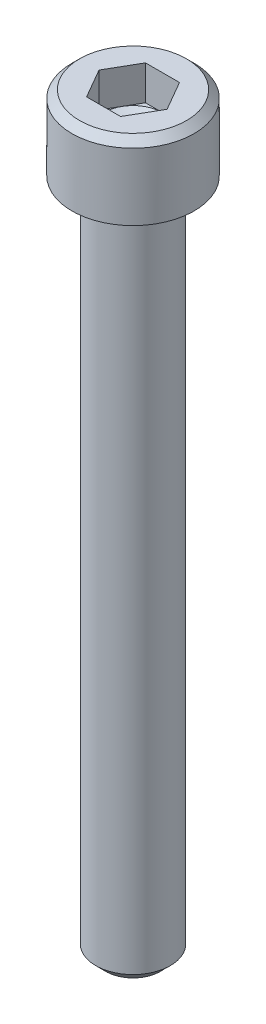
ISO-10303-21;
HEADER;
FILE_DESCRIPTION(('STEP AP214'),'2;1');
FILE_NAME('part.step','',(''),(''),'','','');
FILE_SCHEMA(('AUTOMOTIVE_DESIGN { 1 0 10303 214 1 1 1 1 }'));
ENDSEC;
DATA;
#1=APPLICATION_CONTEXT('core data for automotive mechanical design processes');
#2=APPLICATION_PROTOCOL_DEFINITION('international standard','automotive_design',2000,#1);
#3=PRODUCT_CONTEXT('',#1,'mechanical');
#4=PRODUCT('Part','Part','',(#3));
#5=PRODUCT_RELATED_PRODUCT_CATEGORY('part','',(#4));
#6=PRODUCT_DEFINITION_FORMATION('','',#4);
#7=PRODUCT_DEFINITION_CONTEXT('part definition',#1,'design');
#8=PRODUCT_DEFINITION('design','',#6,#7);
#9=PRODUCT_DEFINITION_SHAPE('','',#8);
#10=(LENGTH_UNIT() NAMED_UNIT(*) SI_UNIT(.MILLI.,.METRE.));
#11=(NAMED_UNIT(*) PLANE_ANGLE_UNIT() SI_UNIT($,.RADIAN.));
#12=(NAMED_UNIT(*) SI_UNIT($,.STERADIAN.) SOLID_ANGLE_UNIT());
#13=UNCERTAINTY_MEASURE_WITH_UNIT(LENGTH_MEASURE(1.E-05),#10,'distance_accuracy_value','');
#14=(GEOMETRIC_REPRESENTATION_CONTEXT(3) GLOBAL_UNCERTAINTY_ASSIGNED_CONTEXT((#13)) GLOBAL_UNIT_ASSIGNED_CONTEXT((#10,
#11,#12)) REPRESENTATION_CONTEXT('',''));
#15=CARTESIAN_POINT('',(0.,0.,0.));
#16=DIRECTION('',(0.,0.,1.));
#17=DIRECTION('',(1.,0.,0.));
#18=AXIS2_PLACEMENT_3D('',#15,#16,#17);
#19=CARTESIAN_POINT('',(0.,1.8796,0.));
#20=DIRECTION('',(0.,1.,0.));
#21=DIRECTION('',(0.,0.,1.));
#22=AXIS2_PLACEMENT_3D('',#19,#20,#21);
#23=PLANE('',#22);
#24=DIRECTION('',(-1.,0.,0.));
#25=VECTOR('',#24,1.);
#26=CARTESIAN_POINT('',(0.799225977638982,1.8796,-1.38429999999987));
#27=LINE('',#26,#25);
#28=CARTESIAN_POINT('',(0.799225977638982,1.8796,-1.38429999999987));
#29=VERTEX_POINT('',#28);
#30=CARTESIAN_POINT('',(0.,1.87959999999497,-1.38429999999987));
#31=VERTEX_POINT('',#30);
#32=EDGE_CURVE('E190',#29,#31,#27,.T.);
#33=ORIENTED_EDGE('',*,*,#32,.T.);
#34=CARTESIAN_POINT('',(0.,1.87959999999497,0.));
#35=DIRECTION('',(0.,-1.,0.));
#36=DIRECTION('',(0.,0.,-1.));
#37=AXIS2_PLACEMENT_3D('',#34,#35,#36);
#38=CIRCLE('',#37,1.38430000004078);
#39=CARTESIAN_POINT('',(1.19883896649411,1.87959999999497,-0.692150000020388));
#40=VERTEX_POINT('',#39);
#41=EDGE_CURVE('E57',#31,#40,#38,.T.);
#42=ORIENTED_EDGE('',*,*,#41,.T.);
#43=DIRECTION('',(-0.5,0.,-0.866025403784439));
#44=VECTOR('',#43,1.);
#45=CARTESIAN_POINT('',(1.59845195527816,1.8796,0.));
#46=LINE('',#45,#44);
#47=EDGE_CURVE('E338',#40,#29,#46,.T.);
#48=ORIENTED_EDGE('',*,*,#47,.T.);
#49=EDGE_LOOP('',(#33,#42,#48));
#50=FACE_BOUND('',#49,.T.);
#51=ADVANCED_FACE('F38',(#50),#23,.T.);
#52=CARTESIAN_POINT('',(1.59845195527816,1.8796,0.));
#53=VERTEX_POINT('',#52);
#54=EDGE_CURVE('E339',#53,#40,#46,.T.);
#55=ORIENTED_EDGE('',*,*,#54,.T.);
#56=CARTESIAN_POINT('',(1.19883896649411,1.87959999999497,0.692150000020388));
#57=VERTEX_POINT('',#56);
#58=EDGE_CURVE('E245',#40,#57,#38,.T.);
#59=ORIENTED_EDGE('',*,*,#58,.T.);
#60=DIRECTION('',(0.5,0.,-0.866025403784439));
#61=VECTOR('',#60,1.);
#62=CARTESIAN_POINT('',(0.799225977639064,1.8796,1.38429999999992));
#63=LINE('',#62,#61);
#64=EDGE_CURVE('E333',#57,#53,#63,.T.);
#65=ORIENTED_EDGE('',*,*,#64,.T.);
#66=EDGE_LOOP('',(#55,#59,#65));
#67=FACE_BOUND('',#66,.T.);
#68=ADVANCED_FACE('F148',(#67),#23,.T.);
#69=CARTESIAN_POINT('',(0.799225977639064,1.8796,1.38429999999992));
#70=VERTEX_POINT('',#69);
#71=EDGE_CURVE('E322',#70,#57,#63,.T.);
#72=ORIENTED_EDGE('',*,*,#71,.T.);
#73=CARTESIAN_POINT('',(0.,1.87959999999497,1.38430000004078));
#74=VERTEX_POINT('',#73);
#75=EDGE_CURVE('E353',#57,#74,#38,.T.);
#76=ORIENTED_EDGE('',*,*,#75,.T.);
#77=DIRECTION('',(1.,0.,0.));
#78=VECTOR('',#77,1.);
#79=CARTESIAN_POINT('',(-0.799225977639255,1.8796,1.38429999999992));
#80=LINE('',#79,#78);
#81=EDGE_CURVE('E219',#74,#70,#80,.T.);
#82=ORIENTED_EDGE('',*,*,#81,.T.);
#83=EDGE_LOOP('',(#72,#76,#82));
#84=FACE_BOUND('',#83,.T.);
#85=ADVANCED_FACE('F154',(#84),#23,.T.);
#86=CARTESIAN_POINT('',(-0.799225977639255,1.8796,1.38429999999992));
#87=VERTEX_POINT('',#86);
#88=EDGE_CURVE('E325',#87,#74,#80,.T.);
#89=ORIENTED_EDGE('',*,*,#88,.T.);
#90=CARTESIAN_POINT('',(-1.19883896649414,1.87959999999497,0.692150000020335));
#91=VERTEX_POINT('',#90);
#92=EDGE_CURVE('E332',#74,#91,#38,.T.);
#93=ORIENTED_EDGE('',*,*,#92,.T.);
#94=DIRECTION('',(0.499999999999962,0.,0.866025403784461));
#95=VECTOR('',#94,1.);
#96=CARTESIAN_POINT('',(-1.59845195527835,1.8796,0.));
#97=LINE('',#96,#95);
#98=EDGE_CURVE('E181',#91,#87,#97,.T.);
#99=ORIENTED_EDGE('',*,*,#98,.T.);
#100=EDGE_LOOP('',(#89,#93,#99));
#101=FACE_BOUND('',#100,.T.);
#102=ADVANCED_FACE('F169',(#101),#23,.T.);
#103=CARTESIAN_POINT('',(-1.59845195527835,1.8796,0.));
#104=VERTEX_POINT('',#103);
#105=EDGE_CURVE('E187',#104,#91,#97,.T.);
#106=ORIENTED_EDGE('',*,*,#105,.T.);
#107=CARTESIAN_POINT('',(-1.19883896649411,1.87959999999497,-0.692150000020388));
#108=VERTEX_POINT('',#107);
#109=EDGE_CURVE('E350',#91,#108,#38,.T.);
#110=ORIENTED_EDGE('',*,*,#109,.T.);
#111=DIRECTION('',(-0.5,0.,0.866025403784439));
#112=VECTOR('',#111,1.);
#113=CARTESIAN_POINT('',(-0.799225977639255,1.8796,-1.38429999999987));
#114=LINE('',#113,#112);
#115=EDGE_CURVE('E182',#108,#104,#114,.T.);
#116=ORIENTED_EDGE('',*,*,#115,.T.);
#117=EDGE_LOOP('',(#106,#110,#116));
#118=FACE_BOUND('',#117,.T.);
#119=ADVANCED_FACE('F160',(#118),#23,.T.);
#120=CARTESIAN_POINT('',(-0.799225977639255,1.8796,-1.38429999999987));
#121=VERTEX_POINT('',#120);
#122=EDGE_CURVE('E173',#121,#108,#114,.T.);
#123=ORIENTED_EDGE('',*,*,#122,.T.);
#124=EDGE_CURVE('E174',#108,#31,#38,.T.);
#125=ORIENTED_EDGE('',*,*,#124,.T.);
#126=EDGE_CURVE('E176',#31,#121,#27,.T.);
#127=ORIENTED_EDGE('',*,*,#126,.T.);
#128=EDGE_LOOP('',(#123,#125,#127));
#129=FACE_BOUND('',#128,.T.);
#130=ADVANCED_FACE('F150',(#129),#23,.T.);
#131=CARTESIAN_POINT('',(0.,0.,0.));
#132=DIRECTION('',(0.,-1.,0.));
#133=DIRECTION('',(0.,0.,-1.));
#134=AXIS2_PLACEMENT_3D('',#131,#132,#133);
#135=PLANE('',#134);
#136=CARTESIAN_POINT('',(0.,0.,0.));
#137=DIRECTION('',(0.,-1.,0.));
#138=DIRECTION('',(0.,0.,-1.));
#139=AXIS2_PLACEMENT_3D('',#136,#137,#138);
#140=CIRCLE('',#139,2.0066);
#141=CARTESIAN_POINT('',(0.,0.,-2.0066));
#142=VERTEX_POINT('',#141);
#143=EDGE_CURVE('E11',#142,#142,#140,.F.);
#144=ORIENTED_EDGE('',*,*,#143,.T.);
#145=EDGE_LOOP('',(#144));
#146=FACE_BOUND('',#145,.T.);
#147=CARTESIAN_POINT('',(0.,0.,0.));
#148=DIRECTION('',(0.,-1.,0.));
#149=DIRECTION('',(0.,0.,-1.));
#150=AXIS2_PLACEMENT_3D('',#147,#148,#149);
#151=CIRCLE('',#150,2.8702);
#152=CARTESIAN_POINT('',(0.,0.,-2.8702));
#153=VERTEX_POINT('',#152);
#154=EDGE_CURVE('E223',#153,#153,#151,.T.);
#155=ORIENTED_EDGE('',*,*,#154,.T.);
#156=EDGE_LOOP('',(#155));
#157=FACE_BOUND('',#156,.T.);
#158=ADVANCED_FACE('F159',(#146,#157),#135,.T.);
#159=CARTESIAN_POINT('',(0.,3.5052,0.));
#160=DIRECTION('',(0.,-1.,0.));
#161=DIRECTION('',(0.,0.,-1.));
#162=AXIS2_PLACEMENT_3D('',#159,#160,#161);
#163=CYLINDRICAL_SURFACE('',#162,2.8702);
#164=CARTESIAN_POINT('',(0.,3.14960000004543,0.));
#165=DIRECTION('',(0.,1.,0.));
#166=DIRECTION('',(0.,0.,1.));
#167=AXIS2_PLACEMENT_3D('',#164,#165,#166);
#168=CIRCLE('',#167,2.8702);
#169=CARTESIAN_POINT('',(0.,3.14960000004543,2.8702));
#170=VERTEX_POINT('',#169);
#171=EDGE_CURVE('E248',#170,#170,#168,.F.);
#172=ORIENTED_EDGE('',*,*,#171,.T.);
#173=EDGE_LOOP('',(#172));
#174=FACE_BOUND('',#173,.T.);
#175=ORIENTED_EDGE('',*,*,#154,.F.);
#176=EDGE_LOOP('',(#175));
#177=FACE_BOUND('',#176,.T.);
#178=ADVANCED_FACE('F166',(#174,#177),#163,.T.);
#179=CARTESIAN_POINT('',(2.8702,3.5052,0.));
#180=DIRECTION('',(0.,1.,0.));
#181=DIRECTION('',(0.,0.,1.));
#182=AXIS2_PLACEMENT_3D('',#179,#180,#181);
#183=PLANE('',#182);
#184=CARTESIAN_POINT('',(0.,3.5052,0.));
#185=DIRECTION('',(0.,1.,0.));
#186=DIRECTION('',(0.,0.,1.));
#187=AXIS2_PLACEMENT_3D('',#184,#185,#186);
#188=CIRCLE('',#187,2.51459999998859);
#189=CARTESIAN_POINT('',(0.,3.5052,2.51459999998859));
#190=VERTEX_POINT('',#189);
#191=EDGE_CURVE('E252',#190,#190,#188,.T.);
#192=ORIENTED_EDGE('',*,*,#191,.T.);
#193=EDGE_LOOP('',(#192));
#194=FACE_BOUND('',#193,.T.);
#195=DIRECTION('',(1.,0.,0.));
#196=VECTOR('',#195,1.);
#197=CARTESIAN_POINT('',(-0.799225977639255,3.5052,1.38429999999992));
#198=LINE('',#197,#196);
#199=CARTESIAN_POINT('',(-0.799225977639255,3.5052,1.38429999999992));
#200=VERTEX_POINT('',#199);
#201=CARTESIAN_POINT('',(0.799225977639064,3.5052,1.38429999999992));
#202=VERTEX_POINT('',#201);
#203=EDGE_CURVE('E68',#200,#202,#198,.T.);
#204=ORIENTED_EDGE('',*,*,#203,.F.);
#205=DIRECTION('',(0.499999999999962,0.,0.866025403784461));
#206=VECTOR('',#205,1.);
#207=CARTESIAN_POINT('',(-1.59845195527835,3.5052,0.));
#208=LINE('',#207,#206);
#209=CARTESIAN_POINT('',(-1.59845195527835,3.5052,0.));
#210=VERTEX_POINT('',#209);
#211=EDGE_CURVE('E215',#210,#200,#208,.T.);
#212=ORIENTED_EDGE('',*,*,#211,.F.);
#213=DIRECTION('',(-0.5,0.,0.866025403784439));
#214=VECTOR('',#213,1.);
#215=CARTESIAN_POINT('',(-0.799225977639255,3.5052,-1.38429999999987));
#216=LINE('',#215,#214);
#217=CARTESIAN_POINT('',(-0.799225977639255,3.5052,-1.38429999999987));
#218=VERTEX_POINT('',#217);
#219=EDGE_CURVE('E211',#218,#210,#216,.T.);
#220=ORIENTED_EDGE('',*,*,#219,.F.);
#221=DIRECTION('',(-1.,0.,0.));
#222=VECTOR('',#221,1.);
#223=CARTESIAN_POINT('',(0.799225977638982,3.5052,-1.38429999999987));
#224=LINE('',#223,#222);
#225=CARTESIAN_POINT('',(0.799225977638982,3.5052,-1.38429999999987));
#226=VERTEX_POINT('',#225);
#227=EDGE_CURVE('E207',#226,#218,#224,.T.);
#228=ORIENTED_EDGE('',*,*,#227,.F.);
#229=DIRECTION('',(-0.5,0.,-0.866025403784439));
#230=VECTOR('',#229,1.);
#231=CARTESIAN_POINT('',(1.59845195527816,3.5052,0.));
#232=LINE('',#231,#230);
#233=CARTESIAN_POINT('',(1.59845195527816,3.5052,0.));
#234=VERTEX_POINT('',#233);
#235=EDGE_CURVE('E203',#234,#226,#232,.T.);
#236=ORIENTED_EDGE('',*,*,#235,.F.);
#237=DIRECTION('',(0.5,0.,-0.866025403784439));
#238=VECTOR('',#237,1.);
#239=CARTESIAN_POINT('',(0.799225977639064,3.5052,1.38429999999992));
#240=LINE('',#239,#238);
#241=EDGE_CURVE('E199',#202,#234,#240,.T.);
#242=ORIENTED_EDGE('',*,*,#241,.F.);
#243=EDGE_LOOP('',(#204,#212,#220,#228,#236,#242));
#244=FACE_BOUND('',#243,.T.);
#245=ADVANCED_FACE('F274',(#194,#244),#183,.T.);
#246=CARTESIAN_POINT('',(0.,-31.75,0.));
#247=DIRECTION('',(0.,1.,0.));
#248=DIRECTION('',(0.,0.,1.));
#249=AXIS2_PLACEMENT_3D('',#246,#247,#248);
#250=CYLINDRICAL_SURFACE('',#249,1.7526);
#251=CARTESIAN_POINT('',(0.,-0.253999999999997,0.));
#252=DIRECTION('',(0.,-1.,0.));
#253=DIRECTION('',(0.,0.,-1.));
#254=AXIS2_PLACEMENT_3D('',#251,#252,#253);
#255=CIRCLE('',#254,1.7526);
#256=CARTESIAN_POINT('',(0.,-0.253999999999997,-1.7526));
#257=VERTEX_POINT('',#256);
#258=EDGE_CURVE('E47',#257,#257,#255,.T.);
#259=ORIENTED_EDGE('',*,*,#258,.T.);
#260=EDGE_LOOP('',(#259));
#261=FACE_BOUND('',#260,.T.);
#262=CARTESIAN_POINT('',(0.,-31.2775599999883,0.));
#263=DIRECTION('',(0.,-1.,0.));
#264=DIRECTION('',(0.,0.,-1.));
#265=AXIS2_PLACEMENT_3D('',#262,#263,#264);
#266=CIRCLE('',#265,1.7526);
#267=CARTESIAN_POINT('',(0.,-31.2775599999883,-1.7526));
#268=VERTEX_POINT('',#267);
#269=EDGE_CURVE('E244',#268,#268,#266,.F.);
#270=ORIENTED_EDGE('',*,*,#269,.T.);
#271=EDGE_LOOP('',(#270));
#272=FACE_BOUND('',#271,.T.);
#273=ADVANCED_FACE('F260',(#261,#272),#250,.T.);
#274=CARTESIAN_POINT('',(0.,-31.75,0.));
#275=DIRECTION('',(0.,-1.,0.));
#276=DIRECTION('',(0.,0.,-1.));
#277=AXIS2_PLACEMENT_3D('',#274,#275,#276);
#278=PLANE('',#277);
#279=CARTESIAN_POINT('',(0.,-31.75,0.));
#280=DIRECTION('',(0.,-1.,0.));
#281=DIRECTION('',(0.,0.,-1.));
#282=AXIS2_PLACEMENT_3D('',#279,#280,#281);
#283=CIRCLE('',#282,1.28015999998831);
#284=CARTESIAN_POINT('',(0.,-31.75,-1.28015999998831));
#285=VERTEX_POINT('',#284);
#286=EDGE_CURVE('E241',#285,#285,#283,.T.);
#287=ORIENTED_EDGE('',*,*,#286,.T.);
#288=EDGE_LOOP('',(#287));
#289=FACE_BOUND('',#288,.T.);
#290=ADVANCED_FACE('F285',(#289),#278,.T.);
#291=CARTESIAN_POINT('',(-0.799225977639255,1.8796,1.38429999999992));
#292=DIRECTION('',(0.,0.,1.));
#293=DIRECTION('',(1.,0.,0.));
#294=AXIS2_PLACEMENT_3D('',#291,#292,#293);
#295=PLANE('',#294);
#296=ORIENTED_EDGE('',*,*,#203,.T.);
#297=DIRECTION('',(0.,1.,0.));
#298=VECTOR('',#297,1.);
#299=CARTESIAN_POINT('',(0.799225977639064,1.8796,1.38429999999992));
#300=LINE('',#299,#298);
#301=EDGE_CURVE('E196',#70,#202,#300,.T.);
#302=ORIENTED_EDGE('',*,*,#301,.F.);
#303=ORIENTED_EDGE('',*,*,#81,.F.);
#304=ORIENTED_EDGE('',*,*,#88,.F.);
#305=DIRECTION('',(0.,1.,0.));
#306=VECTOR('',#305,1.);
#307=CARTESIAN_POINT('',(-0.799225977639255,1.8796,1.38429999999992));
#308=LINE('',#307,#306);
#309=EDGE_CURVE('E220',#87,#200,#308,.T.);
#310=ORIENTED_EDGE('',*,*,#309,.T.);
#311=EDGE_LOOP('',(#296,#302,#303,#304,#310));
#312=FACE_BOUND('',#311,.T.);
#313=ADVANCED_FACE('F288',(#312),#295,.F.);
#314=CARTESIAN_POINT('',(-1.59845195527835,1.8796,0.));
#315=DIRECTION('',(-0.866025403784461,0.,0.499999999999962));
#316=DIRECTION('',(0.499999999999962,0.,0.866025403784461));
#317=AXIS2_PLACEMENT_3D('',#314,#315,#316);
#318=PLANE('',#317);
#319=ORIENTED_EDGE('',*,*,#211,.T.);
#320=ORIENTED_EDGE('',*,*,#309,.F.);
#321=ORIENTED_EDGE('',*,*,#98,.F.);
#322=ORIENTED_EDGE('',*,*,#105,.F.);
#323=DIRECTION('',(0.,1.,0.));
#324=VECTOR('',#323,1.);
#325=CARTESIAN_POINT('',(-1.59845195527835,1.8796,0.));
#326=LINE('',#325,#324);
#327=EDGE_CURVE('E224',#104,#210,#326,.T.);
#328=ORIENTED_EDGE('',*,*,#327,.T.);
#329=EDGE_LOOP('',(#319,#320,#321,#322,#328));
#330=FACE_BOUND('',#329,.T.);
#331=ADVANCED_FACE('F291',(#330),#318,.F.);
#332=CARTESIAN_POINT('',(-0.799225977639255,1.8796,-1.38429999999987));
#333=DIRECTION('',(-0.866025403784439,0.,-0.5));
#334=DIRECTION('',(-0.5,0.,0.866025403784439));
#335=AXIS2_PLACEMENT_3D('',#332,#333,#334);
#336=PLANE('',#335);
#337=ORIENTED_EDGE('',*,*,#219,.T.);
#338=ORIENTED_EDGE('',*,*,#327,.F.);
#339=ORIENTED_EDGE('',*,*,#115,.F.);
#340=ORIENTED_EDGE('',*,*,#122,.F.);
#341=DIRECTION('',(0.,1.,0.));
#342=VECTOR('',#341,1.);
#343=CARTESIAN_POINT('',(-0.799225977639255,1.8796,-1.38429999999987));
#344=LINE('',#343,#342);
#345=EDGE_CURVE('E227',#121,#218,#344,.T.);
#346=ORIENTED_EDGE('',*,*,#345,.T.);
#347=EDGE_LOOP('',(#337,#338,#339,#340,#346));
#348=FACE_BOUND('',#347,.T.);
#349=ADVANCED_FACE('F299',(#348),#336,.F.);
#350=CARTESIAN_POINT('',(0.799225977638982,1.8796,-1.38429999999987));
#351=DIRECTION('',(0.,0.,-1.));
#352=DIRECTION('',(-1.,0.,0.));
#353=AXIS2_PLACEMENT_3D('',#350,#351,#352);
#354=PLANE('',#353);
#355=ORIENTED_EDGE('',*,*,#227,.T.);
#356=ORIENTED_EDGE('',*,*,#345,.F.);
#357=ORIENTED_EDGE('',*,*,#126,.F.);
#358=ORIENTED_EDGE('',*,*,#32,.F.);
#359=DIRECTION('',(0.,1.,0.));
#360=VECTOR('',#359,1.);
#361=CARTESIAN_POINT('',(0.799225977638982,1.8796,-1.38429999999987));
#362=LINE('',#361,#360);
#363=EDGE_CURVE('E230',#29,#226,#362,.T.);
#364=ORIENTED_EDGE('',*,*,#363,.T.);
#365=EDGE_LOOP('',(#355,#356,#357,#358,#364));
#366=FACE_BOUND('',#365,.T.);
#367=ADVANCED_FACE('F295',(#366),#354,.F.);
#368=CARTESIAN_POINT('',(1.59845195527816,1.8796,0.));
#369=DIRECTION('',(0.866025403784439,0.,-0.5));
#370=DIRECTION('',(-0.5,0.,-0.866025403784439));
#371=AXIS2_PLACEMENT_3D('',#368,#369,#370);
#372=PLANE('',#371);
#373=ORIENTED_EDGE('',*,*,#235,.T.);
#374=ORIENTED_EDGE('',*,*,#363,.F.);
#375=ORIENTED_EDGE('',*,*,#47,.F.);
#376=ORIENTED_EDGE('',*,*,#54,.F.);
#377=DIRECTION('',(0.,1.,0.));
#378=VECTOR('',#377,1.);
#379=CARTESIAN_POINT('',(1.59845195527816,1.8796,0.));
#380=LINE('',#379,#378);
#381=EDGE_CURVE('E233',#53,#234,#380,.T.);
#382=ORIENTED_EDGE('',*,*,#381,.T.);
#383=EDGE_LOOP('',(#373,#374,#375,#376,#382));
#384=FACE_BOUND('',#383,.T.);
#385=ADVANCED_FACE('F143',(#384),#372,.F.);
#386=CARTESIAN_POINT('',(0.799225977639064,1.8796,1.38429999999992));
#387=DIRECTION('',(0.866025403784439,0.,0.5));
#388=DIRECTION('',(0.5,0.,-0.866025403784439));
#389=AXIS2_PLACEMENT_3D('',#386,#387,#388);
#390=PLANE('',#389);
#391=ORIENTED_EDGE('',*,*,#241,.T.);
#392=ORIENTED_EDGE('',*,*,#381,.F.);
#393=ORIENTED_EDGE('',*,*,#64,.F.);
#394=ORIENTED_EDGE('',*,*,#71,.F.);
#395=ORIENTED_EDGE('',*,*,#301,.T.);
#396=EDGE_LOOP('',(#391,#392,#393,#394,#395));
#397=FACE_BOUND('',#396,.T.);
#398=ADVANCED_FACE('F134',(#397),#390,.F.);
#399=CARTESIAN_POINT('',(0.,1.08037402233223,0.));
#400=DIRECTION('',(0.,1.,0.));
#401=DIRECTION('',(0.,0.,1.));
#402=AXIS2_PLACEMENT_3D('',#399,#400,#401);
#403=CONICAL_SURFACE('',#402,0.,1.0471975511966);
#404=ORIENTED_EDGE('',*,*,#41,.F.);
#405=ORIENTED_EDGE('',*,*,#124,.F.);
#406=ORIENTED_EDGE('',*,*,#109,.F.);
#407=ORIENTED_EDGE('',*,*,#92,.F.);
#408=ORIENTED_EDGE('',*,*,#75,.F.);
#409=ORIENTED_EDGE('',*,*,#58,.F.);
#410=EDGE_LOOP('',(#404,#405,#406,#407,#408,#409));
#411=FACE_BOUND('',#410,.T.);
#412=CARTESIAN_POINT('',(0.,1.08037402233223,0.));
#413=VERTEX_POINT('',#412);
#414=VERTEX_LOOP('',#413);
#415=FACE_BOUND('',#414,.T.);
#416=ADVANCED_FACE('F131',(#411,#415),#403,.F.);
#417=CARTESIAN_POINT('',(0.,-31.75,0.));
#418=DIRECTION('',(0.,1.,0.));
#419=DIRECTION('',(0.,0.,1.));
#420=AXIS2_PLACEMENT_3D('',#417,#418,#419);
#421=CONICAL_SURFACE('',#420,1.28015999998831,0.785398163397441);
#422=ORIENTED_EDGE('',*,*,#269,.F.);
#423=EDGE_LOOP('',(#422));
#424=FACE_BOUND('',#423,.T.);
#425=ORIENTED_EDGE('',*,*,#286,.F.);
#426=EDGE_LOOP('',(#425));
#427=FACE_BOUND('',#426,.T.);
#428=ADVANCED_FACE('F133',(#424,#427),#421,.T.);
#429=CARTESIAN_POINT('',(0.,3.14960000004543,0.));
#430=DIRECTION('',(0.,-1.,0.));
#431=DIRECTION('',(0.,0.,-1.));
#432=AXIS2_PLACEMENT_3D('',#429,#430,#431);
#433=CONICAL_SURFACE('',#432,2.8702,0.785398163477374);
#434=ORIENTED_EDGE('',*,*,#191,.F.);
#435=EDGE_LOOP('',(#434));
#436=FACE_BOUND('',#435,.T.);
#437=ORIENTED_EDGE('',*,*,#171,.F.);
#438=EDGE_LOOP('',(#437));
#439=FACE_BOUND('',#438,.T.);
#440=ADVANCED_FACE('F140',(#436,#439),#433,.T.);
#441=CARTESIAN_POINT('',(0.,-0.253999999999997,0.));
#442=DIRECTION('',(0.,-1.,0.));
#443=DIRECTION('',(0.,0.,-1.));
#444=AXIS2_PLACEMENT_3D('',#441,#442,#443);
#445=TOROIDAL_SURFACE('',#444,2.0066,0.254);
#446=ORIENTED_EDGE('',*,*,#143,.F.);
#447=EDGE_LOOP('',(#446));
#448=FACE_BOUND('',#447,.T.);
#449=ORIENTED_EDGE('',*,*,#258,.F.);
#450=EDGE_LOOP('',(#449));
#451=FACE_BOUND('',#450,.T.);
#452=ADVANCED_FACE('F40',(#448,#451),#445,.F.);
#453=CLOSED_SHELL('',(#51,#68,#85,#102,#119,#130,#158,#178,#245,#273,#290,#313,#331,#349,#367,
#385,#398,#416,#428,#440,#452));
#454=MANIFOLD_SOLID_BREP('B2',#453);
#455=ADVANCED_BREP_SHAPE_REPRESENTATION('',(#18,#454),#14);
#456=SHAPE_DEFINITION_REPRESENTATION(#9,#455);
ENDSEC;
END-ISO-10303-21;
